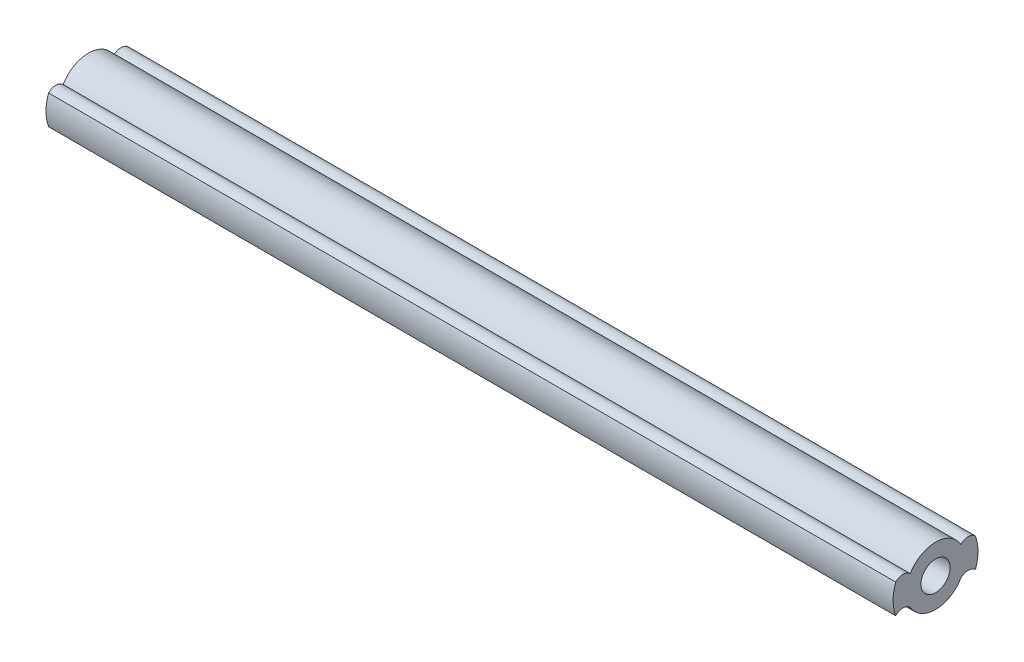
ISO-10303-21;
HEADER;
FILE_DESCRIPTION(('STEP AP214'),'2;1');
FILE_NAME('part.step','',(''),(''),'','','');
FILE_SCHEMA(('AUTOMOTIVE_DESIGN { 1 0 10303 214 1 1 1 1 }'));
ENDSEC;
DATA;
#1=APPLICATION_CONTEXT('core data for automotive mechanical design processes');
#2=APPLICATION_PROTOCOL_DEFINITION('international standard','automotive_design',2000,#1);
#3=PRODUCT_CONTEXT('',#1,'mechanical');
#4=PRODUCT('Part','Part','',(#3));
#5=PRODUCT_RELATED_PRODUCT_CATEGORY('part','',(#4));
#6=PRODUCT_DEFINITION_FORMATION('','',#4);
#7=PRODUCT_DEFINITION_CONTEXT('part definition',#1,'design');
#8=PRODUCT_DEFINITION('design','',#6,#7);
#9=PRODUCT_DEFINITION_SHAPE('','',#8);
#10=(LENGTH_UNIT() NAMED_UNIT(*) SI_UNIT(.MILLI.,.METRE.));
#11=(NAMED_UNIT(*) PLANE_ANGLE_UNIT() SI_UNIT($,.RADIAN.));
#12=(NAMED_UNIT(*) SI_UNIT($,.STERADIAN.) SOLID_ANGLE_UNIT());
#13=UNCERTAINTY_MEASURE_WITH_UNIT(LENGTH_MEASURE(1.E-05),#10,'distance_accuracy_value','');
#14=(GEOMETRIC_REPRESENTATION_CONTEXT(3) GLOBAL_UNCERTAINTY_ASSIGNED_CONTEXT((#13)) GLOBAL_UNIT_ASSIGNED_CONTEXT((#10,
#11,#12)) REPRESENTATION_CONTEXT('',''));
#15=CARTESIAN_POINT('',(0.,0.,0.));
#16=DIRECTION('',(0.,0.,1.));
#17=DIRECTION('',(1.,0.,0.));
#18=AXIS2_PLACEMENT_3D('',#15,#16,#17);
#19=CARTESIAN_POINT('',(290.,0.,0.));
#20=DIRECTION('',(-1.,0.,0.));
#21=DIRECTION('',(0.,0.,1.));
#22=AXIS2_PLACEMENT_3D('',#19,#20,#21);
#23=CYLINDRICAL_SURFACE('',#22,10.0000000000014);
#24=CARTESIAN_POINT('',(0.,0.,0.));
#25=DIRECTION('',(1.,0.,0.));
#26=DIRECTION('',(0.,0.,-1.));
#27=AXIS2_PLACEMENT_3D('',#24,#25,#26);
#28=CIRCLE('',#27,10.0000000000014);
#29=CARTESIAN_POINT('',(0.,-5.01116389138023,-8.65379896078914));
#30=VERTEX_POINT('',#29);
#31=CARTESIAN_POINT('',(0.,-5.01116389138059,8.65379896078893));
#32=VERTEX_POINT('',#31);
#33=EDGE_CURVE('E142',#30,#32,#28,.F.);
#34=ORIENTED_EDGE('',*,*,#33,.F.);
#35=DIRECTION('',(-1.,0.,0.));
#36=VECTOR('',#35,1.);
#37=CARTESIAN_POINT('',(290.,-5.01116389138023,-8.65379896078914));
#38=LINE('',#37,#36);
#39=CARTESIAN_POINT('',(290.,-5.01116389138023,-8.65379896078914));
#40=VERTEX_POINT('',#39);
#41=EDGE_CURVE('E11',#40,#30,#38,.T.);
#42=ORIENTED_EDGE('',*,*,#41,.F.);
#43=CARTESIAN_POINT('',(290.,0.,0.));
#44=DIRECTION('',(1.,0.,0.));
#45=DIRECTION('',(0.,0.,-1.));
#46=AXIS2_PLACEMENT_3D('',#43,#44,#45);
#47=CIRCLE('',#46,10.0000000000014);
#48=CARTESIAN_POINT('',(290.,-5.01116389138059,8.65379896078893));
#49=VERTEX_POINT('',#48);
#50=EDGE_CURVE('E162',#40,#49,#47,.F.);
#51=ORIENTED_EDGE('',*,*,#50,.T.);
#52=DIRECTION('',(-1.,0.,0.));
#53=VECTOR('',#52,1.);
#54=CARTESIAN_POINT('',(290.,-5.01116389138059,8.65379896078893));
#55=LINE('',#54,#53);
#56=EDGE_CURVE('E58',#49,#32,#55,.T.);
#57=ORIENTED_EDGE('',*,*,#56,.T.);
#58=EDGE_LOOP('',(#34,#42,#51,#57));
#59=FACE_BOUND('',#58,.T.);
#60=ADVANCED_FACE('F43',(#59),#23,.T.);
#61=CARTESIAN_POINT('',(290.,-7.51442697374825,-11.1591673603012));
#62=DIRECTION('',(-1.,0.,0.));
#63=DIRECTION('',(0.,0.,1.));
#64=AXIS2_PLACEMENT_3D('',#61,#62,#63);
#65=CYLINDRICAL_SURFACE('',#64,3.5416375981769);
#66=CARTESIAN_POINT('',(0.,-7.51442697374825,-11.1591673603012));
#67=DIRECTION('',(1.,0.,0.));
#68=DIRECTION('',(0.,0.,-1.));
#69=AXIS2_PLACEMENT_3D('',#66,#67,#68);
#70=CIRCLE('',#69,3.5416375981769);
#71=CARTESIAN_POINT('',(0.,-5.0090590163366,-13.6624308851414));
#72=VERTEX_POINT('',#71);
#73=EDGE_CURVE('E145',#30,#72,#70,.F.);
#74=ORIENTED_EDGE('',*,*,#73,.T.);
#75=DIRECTION('',(-1.,0.,0.));
#76=VECTOR('',#75,1.);
#77=CARTESIAN_POINT('',(290.,-5.0090590163366,-13.6624308851414));
#78=LINE('',#77,#76);
#79=CARTESIAN_POINT('',(290.,-5.0090590163366,-13.6624308851414));
#80=VERTEX_POINT('',#79);
#81=EDGE_CURVE('E55',#80,#72,#78,.T.);
#82=ORIENTED_EDGE('',*,*,#81,.F.);
#83=CARTESIAN_POINT('',(290.,-7.51442697374825,-11.1591673603012));
#84=DIRECTION('',(1.,0.,0.));
#85=DIRECTION('',(0.,0.,-1.));
#86=AXIS2_PLACEMENT_3D('',#83,#84,#85);
#87=CIRCLE('',#86,3.5416375981769);
#88=EDGE_CURVE('E186',#40,#80,#87,.F.);
#89=ORIENTED_EDGE('',*,*,#88,.F.);
#90=ORIENTED_EDGE('',*,*,#41,.T.);
#91=EDGE_LOOP('',(#74,#82,#89,#90));
#92=FACE_BOUND('',#91,.T.);
#93=ADVANCED_FACE('F44',(#92),#65,.F.);
#94=CARTESIAN_POINT('',(290.,-0.00452950816812528,0.270420164318457));
#95=DIRECTION('',(-1.,0.,0.));
#96=DIRECTION('',(0.,0.,1.));
#97=AXIS2_PLACEMENT_3D('',#94,#95,#96);
#98=CYLINDRICAL_SURFACE('',#97,14.804379553516);
#99=CARTESIAN_POINT('',(0.,-0.00452950816812528,0.270420164318457));
#100=DIRECTION('',(1.,0.,0.));
#101=DIRECTION('',(0.,0.,-1.));
#102=AXIS2_PLACEMENT_3D('',#99,#100,#101);
#103=CIRCLE('',#102,14.804379553516);
#104=CARTESIAN_POINT('',(0.,5.00000000000035,-13.6624308851414));
#105=VERTEX_POINT('',#104);
#106=EDGE_CURVE('E146',#105,#72,#103,.F.);
#107=ORIENTED_EDGE('',*,*,#106,.F.);
#108=DIRECTION('',(-1.,0.,0.));
#109=VECTOR('',#108,1.);
#110=CARTESIAN_POINT('',(290.,5.00000000000035,-13.6624308851414));
#111=LINE('',#110,#109);
#112=CARTESIAN_POINT('',(290.,5.00000000000035,-13.6624308851414));
#113=VERTEX_POINT('',#112);
#114=EDGE_CURVE('E166',#113,#105,#111,.T.);
#115=ORIENTED_EDGE('',*,*,#114,.F.);
#116=CARTESIAN_POINT('',(290.,-0.00452950816812528,0.270420164318457));
#117=DIRECTION('',(1.,0.,0.));
#118=DIRECTION('',(0.,0.,-1.));
#119=AXIS2_PLACEMENT_3D('',#116,#117,#118);
#120=CIRCLE('',#119,14.804379553516);
#121=EDGE_CURVE('E176',#113,#80,#120,.F.);
#122=ORIENTED_EDGE('',*,*,#121,.T.);
#123=ORIENTED_EDGE('',*,*,#81,.T.);
#124=EDGE_LOOP('',(#107,#115,#122,#123));
#125=FACE_BOUND('',#124,.T.);
#126=ADVANCED_FACE('F171',(#125),#98,.T.);
#127=CARTESIAN_POINT('',(290.,2.50038412709992,-11.1558560476378));
#128=DIRECTION('',(-1.,0.,0.));
#129=DIRECTION('',(0.,0.,1.));
#130=AXIS2_PLACEMENT_3D('',#127,#128,#129);
#131=CYLINDRICAL_SURFACE('',#130,3.5399148193229);
#132=CARTESIAN_POINT('',(0.,2.50038412709992,-11.1558560476378));
#133=DIRECTION('',(1.,0.,0.));
#134=DIRECTION('',(0.,0.,-1.));
#135=AXIS2_PLACEMENT_3D('',#132,#133,#134);
#136=CIRCLE('',#135,3.5399148193229);
#137=CARTESIAN_POINT('',(0.,5.00695414129438,-8.65623533800943));
#138=VERTEX_POINT('',#137);
#139=EDGE_CURVE('E151',#138,#105,#136,.F.);
#140=ORIENTED_EDGE('',*,*,#139,.F.);
#141=DIRECTION('',(-1.,0.,0.));
#142=VECTOR('',#141,1.);
#143=CARTESIAN_POINT('',(290.,5.00695414129438,-8.65623533800943));
#144=LINE('',#143,#142);
#145=CARTESIAN_POINT('',(290.,5.00695414129438,-8.65623533800943));
#146=VERTEX_POINT('',#145);
#147=EDGE_CURVE('E170',#146,#138,#144,.T.);
#148=ORIENTED_EDGE('',*,*,#147,.F.);
#149=CARTESIAN_POINT('',(290.,2.50038412709992,-11.1558560476378));
#150=DIRECTION('',(1.,0.,0.));
#151=DIRECTION('',(0.,0.,-1.));
#152=AXIS2_PLACEMENT_3D('',#149,#150,#151);
#153=CIRCLE('',#152,3.5399148193229);
#154=EDGE_CURVE('E189',#146,#113,#153,.F.);
#155=ORIENTED_EDGE('',*,*,#154,.T.);
#156=ORIENTED_EDGE('',*,*,#114,.T.);
#157=EDGE_LOOP('',(#140,#148,#155,#156));
#158=FACE_BOUND('',#157,.T.);
#159=ADVANCED_FACE('F187',(#158),#131,.T.);
#160=CARTESIAN_POINT('',(0.,5.00695414129506,8.65623533800904));
#161=VERTEX_POINT('',#160);
#162=EDGE_CURVE('E144',#161,#138,#28,.F.);
#163=ORIENTED_EDGE('',*,*,#162,.F.);
#164=DIRECTION('',(-1.,0.,0.));
#165=VECTOR('',#164,1.);
#166=CARTESIAN_POINT('',(290.,5.00695414129506,8.65623533800904));
#167=LINE('',#166,#165);
#168=CARTESIAN_POINT('',(290.,5.00695414129506,8.65623533800904));
#169=VERTEX_POINT('',#168);
#170=EDGE_CURVE('E132',#169,#161,#167,.T.);
#171=ORIENTED_EDGE('',*,*,#170,.F.);
#172=EDGE_CURVE('E121',#169,#146,#47,.F.);
#173=ORIENTED_EDGE('',*,*,#172,.T.);
#174=ORIENTED_EDGE('',*,*,#147,.T.);
#175=EDGE_LOOP('',(#163,#171,#173,#174));
#176=FACE_BOUND('',#175,.T.);
#177=ADVANCED_FACE('F193',(#176),#23,.T.);
#178=CARTESIAN_POINT('',(290.,2.50038412709957,11.1558560476364));
#179=DIRECTION('',(-1.,0.,0.));
#180=DIRECTION('',(0.,0.,1.));
#181=AXIS2_PLACEMENT_3D('',#178,#179,#180);
#182=CYLINDRICAL_SURFACE('',#181,3.5399148193229);
#183=CARTESIAN_POINT('',(0.,2.50038412709957,11.1558560476364));
#184=DIRECTION('',(1.,0.,0.));
#185=DIRECTION('',(0.,0.,-1.));
#186=AXIS2_PLACEMENT_3D('',#183,#184,#185);
#187=CIRCLE('',#186,3.5399148193229);
#188=CARTESIAN_POINT('',(0.,5.,13.66243088514));
#189=VERTEX_POINT('',#188);
#190=EDGE_CURVE('E126',#161,#189,#187,.T.);
#191=ORIENTED_EDGE('',*,*,#190,.T.);
#192=DIRECTION('',(-1.,0.,0.));
#193=VECTOR('',#192,1.);
#194=CARTESIAN_POINT('',(290.,5.,13.66243088514));
#195=LINE('',#194,#193);
#196=CARTESIAN_POINT('',(290.,5.,13.66243088514));
#197=VERTEX_POINT('',#196);
#198=EDGE_CURVE('E124',#197,#189,#195,.T.);
#199=ORIENTED_EDGE('',*,*,#198,.F.);
#200=CARTESIAN_POINT('',(290.,2.50038412709957,11.1558560476364));
#201=DIRECTION('',(1.,0.,0.));
#202=DIRECTION('',(0.,0.,-1.));
#203=AXIS2_PLACEMENT_3D('',#200,#201,#202);
#204=CIRCLE('',#203,3.5399148193229);
#205=EDGE_CURVE('E112',#169,#197,#204,.T.);
#206=ORIENTED_EDGE('',*,*,#205,.F.);
#207=ORIENTED_EDGE('',*,*,#170,.T.);
#208=EDGE_LOOP('',(#191,#199,#206,#207));
#209=FACE_BOUND('',#208,.T.);
#210=ADVANCED_FACE('F127',(#209),#182,.T.);
#211=CARTESIAN_POINT('',(290.,-0.00452950816847347,-0.270420164319883));
#212=DIRECTION('',(-1.,0.,0.));
#213=DIRECTION('',(0.,0.,1.));
#214=AXIS2_PLACEMENT_3D('',#211,#212,#213);
#215=CYLINDRICAL_SURFACE('',#214,14.804379553516);
#216=CARTESIAN_POINT('',(0.,-0.00452950816847347,-0.270420164319883));
#217=DIRECTION('',(1.,0.,0.));
#218=DIRECTION('',(0.,0.,-1.));
#219=AXIS2_PLACEMENT_3D('',#216,#217,#218);
#220=CIRCLE('',#219,14.804379553516);
#221=CARTESIAN_POINT('',(0.,-5.00905901633696,13.66243088514));
#222=VERTEX_POINT('',#221);
#223=EDGE_CURVE('E154',#189,#222,#220,.T.);
#224=ORIENTED_EDGE('',*,*,#223,.T.);
#225=DIRECTION('',(-1.,0.,0.));
#226=VECTOR('',#225,1.);
#227=CARTESIAN_POINT('',(290.,-5.00905901633696,13.66243088514));
#228=LINE('',#227,#226);
#229=CARTESIAN_POINT('',(290.,-5.00905901633696,13.66243088514));
#230=VERTEX_POINT('',#229);
#231=EDGE_CURVE('E88',#230,#222,#228,.T.);
#232=ORIENTED_EDGE('',*,*,#231,.F.);
#233=CARTESIAN_POINT('',(290.,-0.00452950816847347,-0.270420164319883));
#234=DIRECTION('',(1.,0.,0.));
#235=DIRECTION('',(0.,0.,-1.));
#236=AXIS2_PLACEMENT_3D('',#233,#234,#235);
#237=CIRCLE('',#236,14.804379553516);
#238=EDGE_CURVE('E119',#197,#230,#237,.T.);
#239=ORIENTED_EDGE('',*,*,#238,.F.);
#240=ORIENTED_EDGE('',*,*,#198,.T.);
#241=EDGE_LOOP('',(#224,#232,#239,#240));
#242=FACE_BOUND('',#241,.T.);
#243=ADVANCED_FACE('F134',(#242),#215,.T.);
#244=CARTESIAN_POINT('',(290.,-7.51442697374825,11.1591673602994));
#245=DIRECTION('',(-1.,0.,0.));
#246=DIRECTION('',(0.,0.,1.));
#247=AXIS2_PLACEMENT_3D('',#244,#245,#246);
#248=CYLINDRICAL_SURFACE('',#247,3.5416375981769);
#249=CARTESIAN_POINT('',(0.,-7.51442697374825,11.1591673602994));
#250=DIRECTION('',(1.,0.,0.));
#251=DIRECTION('',(0.,0.,-1.));
#252=AXIS2_PLACEMENT_3D('',#249,#250,#251);
#253=CIRCLE('',#252,3.5416375981769);
#254=EDGE_CURVE('E160',#32,#222,#253,.T.);
#255=ORIENTED_EDGE('',*,*,#254,.F.);
#256=ORIENTED_EDGE('',*,*,#56,.F.);
#257=CARTESIAN_POINT('',(290.,-7.51442697374825,11.1591673602994));
#258=DIRECTION('',(1.,0.,0.));
#259=DIRECTION('',(0.,0.,-1.));
#260=AXIS2_PLACEMENT_3D('',#257,#258,#259);
#261=CIRCLE('',#260,3.5416375981769);
#262=EDGE_CURVE('E131',#49,#230,#261,.T.);
#263=ORIENTED_EDGE('',*,*,#262,.T.);
#264=ORIENTED_EDGE('',*,*,#231,.T.);
#265=EDGE_LOOP('',(#255,#256,#263,#264));
#266=FACE_BOUND('',#265,.T.);
#267=ADVANCED_FACE('F194',(#266),#248,.F.);
#268=CARTESIAN_POINT('',(290.,0.,0.));
#269=DIRECTION('',(-1.,0.,0.));
#270=DIRECTION('',(0.,0.,1.));
#271=AXIS2_PLACEMENT_3D('',#268,#269,#270);
#272=CYLINDRICAL_SURFACE('',#271,5.);
#273=CARTESIAN_POINT('',(290.,0.,0.));
#274=DIRECTION('',(1.,0.,0.));
#275=DIRECTION('',(0.,0.,-1.));
#276=AXIS2_PLACEMENT_3D('',#273,#274,#275);
#277=CIRCLE('',#276,5.);
#278=CARTESIAN_POINT('',(290.,0.,-5.));
#279=VERTEX_POINT('',#278);
#280=EDGE_CURVE('E136',#279,#279,#277,.F.);
#281=ORIENTED_EDGE('',*,*,#280,.F.);
#282=EDGE_LOOP('',(#281));
#283=FACE_BOUND('',#282,.T.);
#284=CARTESIAN_POINT('',(0.,0.,0.));
#285=DIRECTION('',(1.,0.,0.));
#286=DIRECTION('',(0.,0.,-1.));
#287=AXIS2_PLACEMENT_3D('',#284,#285,#286);
#288=CIRCLE('',#287,5.);
#289=CARTESIAN_POINT('',(0.,0.,-5.));
#290=VERTEX_POINT('',#289);
#291=EDGE_CURVE('E159',#290,#290,#288,.F.);
#292=ORIENTED_EDGE('',*,*,#291,.T.);
#293=EDGE_LOOP('',(#292));
#294=FACE_BOUND('',#293,.T.);
#295=ADVANCED_FACE('F197',(#283,#294),#272,.F.);
#296=CARTESIAN_POINT('',(290.,0.,0.));
#297=DIRECTION('',(1.,0.,0.));
#298=DIRECTION('',(0.,0.,-1.));
#299=AXIS2_PLACEMENT_3D('',#296,#297,#298);
#300=PLANE('',#299);
#301=ORIENTED_EDGE('',*,*,#50,.F.);
#302=ORIENTED_EDGE('',*,*,#88,.T.);
#303=ORIENTED_EDGE('',*,*,#121,.F.);
#304=ORIENTED_EDGE('',*,*,#154,.F.);
#305=ORIENTED_EDGE('',*,*,#172,.F.);
#306=ORIENTED_EDGE('',*,*,#205,.T.);
#307=ORIENTED_EDGE('',*,*,#238,.T.);
#308=ORIENTED_EDGE('',*,*,#262,.F.);
#309=EDGE_LOOP('',(#301,#302,#303,#304,#305,#306,#307,#308));
#310=FACE_BOUND('',#309,.T.);
#311=ORIENTED_EDGE('',*,*,#280,.T.);
#312=EDGE_LOOP('',(#311));
#313=FACE_BOUND('',#312,.T.);
#314=ADVANCED_FACE('F111',(#310,#313),#300,.T.);
#315=CARTESIAN_POINT('',(0.,0.,0.));
#316=DIRECTION('',(1.,0.,0.));
#317=DIRECTION('',(0.,0.,-1.));
#318=AXIS2_PLACEMENT_3D('',#315,#316,#317);
#319=PLANE('',#318);
#320=ORIENTED_EDGE('',*,*,#33,.T.);
#321=ORIENTED_EDGE('',*,*,#254,.T.);
#322=ORIENTED_EDGE('',*,*,#223,.F.);
#323=ORIENTED_EDGE('',*,*,#190,.F.);
#324=ORIENTED_EDGE('',*,*,#162,.T.);
#325=ORIENTED_EDGE('',*,*,#139,.T.);
#326=ORIENTED_EDGE('',*,*,#106,.T.);
#327=ORIENTED_EDGE('',*,*,#73,.F.);
#328=EDGE_LOOP('',(#320,#321,#322,#323,#324,#325,#326,#327));
#329=FACE_BOUND('',#328,.T.);
#330=ORIENTED_EDGE('',*,*,#291,.F.);
#331=EDGE_LOOP('',(#330));
#332=FACE_BOUND('',#331,.T.);
#333=ADVANCED_FACE('F179',(#329,#332),#319,.F.);
#334=CLOSED_SHELL('',(#60,#93,#126,#159,#177,#210,#243,#267,#295,#314,#333));
#335=MANIFOLD_SOLID_BREP('B2',#334);
#336=ADVANCED_BREP_SHAPE_REPRESENTATION('',(#18,#335),#14);
#337=SHAPE_DEFINITION_REPRESENTATION(#9,#336);
ENDSEC;
END-ISO-10303-21;
